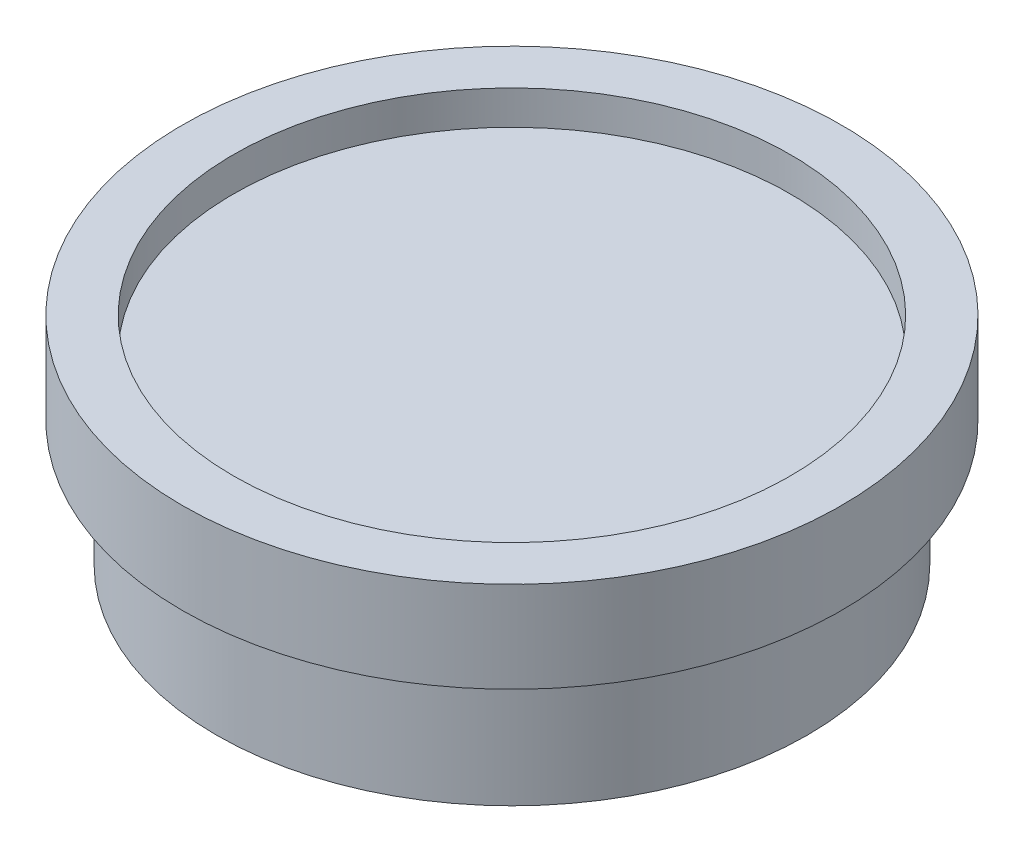
ISO-10303-21;
HEADER;
FILE_DESCRIPTION(('STEP AP214'),'2;1');
FILE_NAME('part.step','',(''),(''),'','','');
FILE_SCHEMA(('AUTOMOTIVE_DESIGN { 1 0 10303 214 1 1 1 1 }'));
ENDSEC;
DATA;
#1=APPLICATION_CONTEXT('core data for automotive mechanical design processes');
#2=APPLICATION_PROTOCOL_DEFINITION('international standard','automotive_design',2000,#1);
#3=PRODUCT_CONTEXT('',#1,'mechanical');
#4=PRODUCT('Part','Part','',(#3));
#5=PRODUCT_RELATED_PRODUCT_CATEGORY('part','',(#4));
#6=PRODUCT_DEFINITION_FORMATION('','',#4);
#7=PRODUCT_DEFINITION_CONTEXT('part definition',#1,'design');
#8=PRODUCT_DEFINITION('design','',#6,#7);
#9=PRODUCT_DEFINITION_SHAPE('','',#8);
#10=(LENGTH_UNIT() NAMED_UNIT(*) SI_UNIT(.MILLI.,.METRE.));
#11=(NAMED_UNIT(*) PLANE_ANGLE_UNIT() SI_UNIT($,.RADIAN.));
#12=(NAMED_UNIT(*) SI_UNIT($,.STERADIAN.) SOLID_ANGLE_UNIT());
#13=UNCERTAINTY_MEASURE_WITH_UNIT(LENGTH_MEASURE(1.E-05),#10,'distance_accuracy_value','');
#14=(GEOMETRIC_REPRESENTATION_CONTEXT(3) GLOBAL_UNCERTAINTY_ASSIGNED_CONTEXT((#13)) GLOBAL_UNIT_ASSIGNED_CONTEXT((#10,
#11,#12)) REPRESENTATION_CONTEXT('',''));
#15=CARTESIAN_POINT('',(0.,0.,0.));
#16=DIRECTION('',(0.,0.,1.));
#17=DIRECTION('',(1.,0.,0.));
#18=AXIS2_PLACEMENT_3D('',#15,#16,#17);
#19=CARTESIAN_POINT('',(0.,-8.,0.));
#20=DIRECTION('',(0.,1.,0.));
#21=DIRECTION('',(0.,0.,1.));
#22=AXIS2_PLACEMENT_3D('',#19,#20,#21);
#23=CYLINDRICAL_SURFACE('',#22,29.);
#24=CARTESIAN_POINT('',(0.,-8.,0.));
#25=DIRECTION('',(0.,1.,0.));
#26=DIRECTION('',(0.,0.,1.));
#27=AXIS2_PLACEMENT_3D('',#24,#25,#26);
#28=CIRCLE('',#27,29.);
#29=CARTESIAN_POINT('',(0.,-8.,29.));
#30=VERTEX_POINT('',#29);
#31=EDGE_CURVE('E37',#30,#30,#28,.T.);
#32=ORIENTED_EDGE('',*,*,#31,.T.);
#33=EDGE_LOOP('',(#32));
#34=FACE_BOUND('',#33,.T.);
#35=CARTESIAN_POINT('',(0.,0.,0.));
#36=DIRECTION('',(0.,1.,0.));
#37=DIRECTION('',(0.,0.,1.));
#38=AXIS2_PLACEMENT_3D('',#35,#36,#37);
#39=CIRCLE('',#38,29.);
#40=CARTESIAN_POINT('',(0.,0.,29.));
#41=VERTEX_POINT('',#40);
#42=EDGE_CURVE('E41',#41,#41,#39,.T.);
#43=ORIENTED_EDGE('',*,*,#42,.F.);
#44=EDGE_LOOP('',(#43));
#45=FACE_BOUND('',#44,.T.);
#46=ADVANCED_FACE('F31',(#34,#45),#23,.T.);
#47=CARTESIAN_POINT('',(0.,-8.,0.));
#48=DIRECTION('',(0.,1.,0.));
#49=DIRECTION('',(0.,0.,1.));
#50=AXIS2_PLACEMENT_3D('',#47,#48,#49);
#51=PLANE('',#50);
#52=CARTESIAN_POINT('',(0.,-8.,0.));
#53=DIRECTION('',(0.,1.,0.));
#54=DIRECTION('',(0.,0.,1.));
#55=AXIS2_PLACEMENT_3D('',#52,#53,#54);
#56=CIRCLE('',#55,26.);
#57=CARTESIAN_POINT('',(0.,-8.,26.));
#58=VERTEX_POINT('',#57);
#59=EDGE_CURVE('E10',#58,#58,#56,.F.);
#60=ORIENTED_EDGE('',*,*,#59,.F.);
#61=EDGE_LOOP('',(#60));
#62=FACE_BOUND('',#61,.T.);
#63=ORIENTED_EDGE('',*,*,#31,.F.);
#64=EDGE_LOOP('',(#63));
#65=FACE_BOUND('',#64,.T.);
#66=ADVANCED_FACE('F70',(#62,#65),#51,.F.);
#67=CARTESIAN_POINT('',(0.,0.,0.));
#68=DIRECTION('',(0.,1.,0.));
#69=DIRECTION('',(0.,0.,1.));
#70=AXIS2_PLACEMENT_3D('',#67,#68,#69);
#71=PLANE('',#70);
#72=CARTESIAN_POINT('',(0.,0.,0.));
#73=DIRECTION('',(0.,1.,0.));
#74=DIRECTION('',(0.,0.,1.));
#75=AXIS2_PLACEMENT_3D('',#72,#73,#74);
#76=CIRCLE('',#75,24.5);
#77=CARTESIAN_POINT('',(0.,0.,24.5));
#78=VERTEX_POINT('',#77);
#79=EDGE_CURVE('E51',#78,#78,#76,.T.);
#80=ORIENTED_EDGE('',*,*,#79,.F.);
#81=EDGE_LOOP('',(#80));
#82=FACE_BOUND('',#81,.T.);
#83=ORIENTED_EDGE('',*,*,#42,.T.);
#84=EDGE_LOOP('',(#83));
#85=FACE_BOUND('',#84,.T.);
#86=ADVANCED_FACE('F66',(#82,#85),#71,.T.);
#87=CARTESIAN_POINT('',(0.,-19.,0.));
#88=DIRECTION('',(0.,1.,0.));
#89=DIRECTION('',(0.,0.,1.));
#90=AXIS2_PLACEMENT_3D('',#87,#88,#89);
#91=CYLINDRICAL_SURFACE('',#90,26.);
#92=CARTESIAN_POINT('',(0.,-19.,0.));
#93=DIRECTION('',(0.,-1.,0.));
#94=DIRECTION('',(0.,0.,-1.));
#95=AXIS2_PLACEMENT_3D('',#92,#93,#94);
#96=CIRCLE('',#95,26.);
#97=CARTESIAN_POINT('',(0.,-19.,-26.));
#98=VERTEX_POINT('',#97);
#99=EDGE_CURVE('E46',#98,#98,#96,.T.);
#100=ORIENTED_EDGE('',*,*,#99,.F.);
#101=EDGE_LOOP('',(#100));
#102=FACE_BOUND('',#101,.T.);
#103=ORIENTED_EDGE('',*,*,#59,.T.);
#104=EDGE_LOOP('',(#103));
#105=FACE_BOUND('',#104,.T.);
#106=ADVANCED_FACE('F69',(#102,#105),#91,.T.);
#107=CARTESIAN_POINT('',(0.,-19.,0.));
#108=DIRECTION('',(0.,-1.,0.));
#109=DIRECTION('',(0.,0.,-1.));
#110=AXIS2_PLACEMENT_3D('',#107,#108,#109);
#111=PLANE('',#110);
#112=ORIENTED_EDGE('',*,*,#99,.T.);
#113=EDGE_LOOP('',(#112));
#114=FACE_BOUND('',#113,.T.);
#115=ADVANCED_FACE('F62',(#114),#111,.T.);
#116=CARTESIAN_POINT('',(0.,-3.,0.));
#117=DIRECTION('',(0.,1.,0.));
#118=DIRECTION('',(0.,0.,1.));
#119=AXIS2_PLACEMENT_3D('',#116,#117,#118);
#120=CYLINDRICAL_SURFACE('',#119,24.5);
#121=CARTESIAN_POINT('',(0.,-3.,0.));
#122=DIRECTION('',(0.,1.,0.));
#123=DIRECTION('',(0.,0.,1.));
#124=AXIS2_PLACEMENT_3D('',#121,#122,#123);
#125=CIRCLE('',#124,24.5);
#126=CARTESIAN_POINT('',(0.,-3.,24.5));
#127=VERTEX_POINT('',#126);
#128=EDGE_CURVE('E50',#127,#127,#125,.T.);
#129=ORIENTED_EDGE('',*,*,#128,.F.);
#130=EDGE_LOOP('',(#129));
#131=FACE_BOUND('',#130,.T.);
#132=ORIENTED_EDGE('',*,*,#79,.T.);
#133=EDGE_LOOP('',(#132));
#134=FACE_BOUND('',#133,.T.);
#135=ADVANCED_FACE('F59',(#131,#134),#120,.F.);
#136=CARTESIAN_POINT('',(0.,-3.,0.));
#137=DIRECTION('',(0.,1.,0.));
#138=DIRECTION('',(0.,0.,1.));
#139=AXIS2_PLACEMENT_3D('',#136,#137,#138);
#140=PLANE('',#139);
#141=ORIENTED_EDGE('',*,*,#128,.T.);
#142=EDGE_LOOP('',(#141));
#143=FACE_BOUND('',#142,.T.);
#144=ADVANCED_FACE('F57',(#143),#140,.T.);
#145=CLOSED_SHELL('',(#46,#66,#86,#106,#115,#135,#144));
#146=MANIFOLD_SOLID_BREP('B2',#145);
#147=ADVANCED_BREP_SHAPE_REPRESENTATION('',(#18,#146),#14);
#148=SHAPE_DEFINITION_REPRESENTATION(#9,#147);
ENDSEC;
END-ISO-10303-21;
